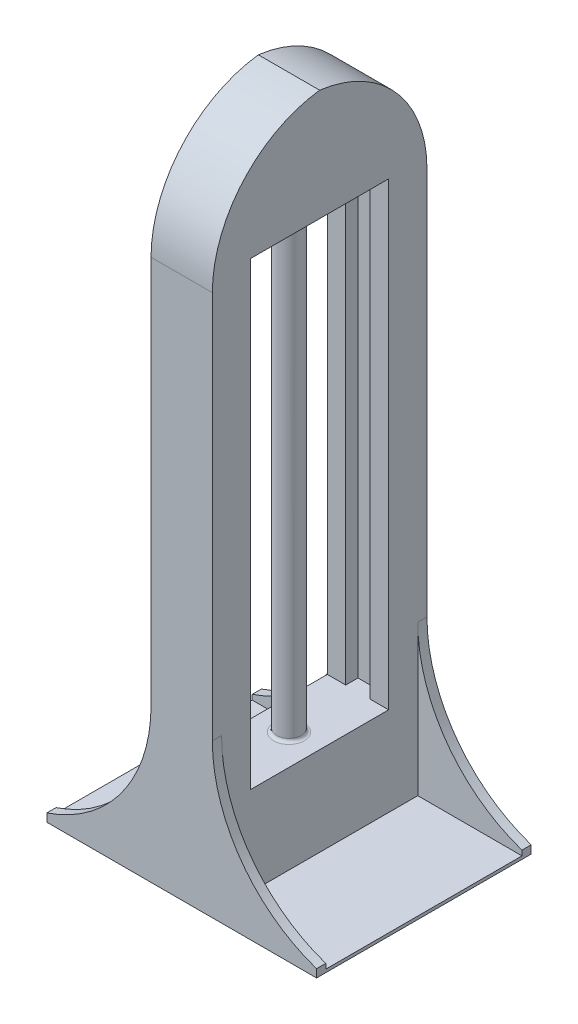
ISO-10303-21;
HEADER;
FILE_DESCRIPTION(('STEP AP214'),'2;1');
FILE_NAME('part.step','',(''),(''),'','','');
FILE_SCHEMA(('AUTOMOTIVE_DESIGN { 1 0 10303 214 1 1 1 1 }'));
ENDSEC;
DATA;
#1=APPLICATION_CONTEXT('core data for automotive mechanical design processes');
#2=APPLICATION_PROTOCOL_DEFINITION('international standard','automotive_design',2000,#1);
#3=PRODUCT_CONTEXT('',#1,'mechanical');
#4=PRODUCT('Part','Part','',(#3));
#5=PRODUCT_RELATED_PRODUCT_CATEGORY('part','',(#4));
#6=PRODUCT_DEFINITION_FORMATION('','',#4);
#7=PRODUCT_DEFINITION_CONTEXT('part definition',#1,'design');
#8=PRODUCT_DEFINITION('design','',#6,#7);
#9=PRODUCT_DEFINITION_SHAPE('','',#8);
#10=(LENGTH_UNIT() NAMED_UNIT(*) SI_UNIT(.MILLI.,.METRE.));
#11=(NAMED_UNIT(*) PLANE_ANGLE_UNIT() SI_UNIT($,.RADIAN.));
#12=(NAMED_UNIT(*) SI_UNIT($,.STERADIAN.) SOLID_ANGLE_UNIT());
#13=UNCERTAINTY_MEASURE_WITH_UNIT(LENGTH_MEASURE(1.E-05),#10,'distance_accuracy_value','');
#14=(GEOMETRIC_REPRESENTATION_CONTEXT(3) GLOBAL_UNCERTAINTY_ASSIGNED_CONTEXT((#13)) GLOBAL_UNIT_ASSIGNED_CONTEXT((#10,
#11,#12)) REPRESENTATION_CONTEXT('',''));
#15=CARTESIAN_POINT('',(0.,0.,0.));
#16=DIRECTION('',(0.,0.,1.));
#17=DIRECTION('',(1.,0.,0.));
#18=AXIS2_PLACEMENT_3D('',#15,#16,#17);
#19=CARTESIAN_POINT('',(-100.,0.,-350.));
#20=DIRECTION('',(0.,-1.,0.));
#21=DIRECTION('',(0.,0.,-1.));
#22=AXIS2_PLACEMENT_3D('',#19,#20,#21);
#23=PLANE('',#22);
#24=DIRECTION('',(1.,0.,0.));
#25=VECTOR('',#24,1.);
#26=CARTESIAN_POINT('',(-100.,0.,350.));
#27=LINE('',#26,#25);
#28=CARTESIAN_POINT('',(-440.,-2.22044604925031E-13,350.));
#29=VERTEX_POINT('',#28);
#30=CARTESIAN_POINT('',(440.,0.,350.));
#31=VERTEX_POINT('',#30);
#32=EDGE_CURVE('E244',#29,#31,#27,.T.);
#33=ORIENTED_EDGE('',*,*,#32,.F.);
#34=DIRECTION('',(0.,0.,1.));
#35=VECTOR('',#34,1.);
#36=CARTESIAN_POINT('',(-440.,0.,-350.));
#37=LINE('',#36,#35);
#38=CARTESIAN_POINT('',(-440.,-2.22044604925031E-13,-350.));
#39=VERTEX_POINT('',#38);
#40=EDGE_CURVE('E229',#39,#29,#37,.T.);
#41=ORIENTED_EDGE('',*,*,#40,.F.);
#42=DIRECTION('',(1.,0.,0.));
#43=VECTOR('',#42,1.);
#44=CARTESIAN_POINT('',(-100.,0.,-350.));
#45=LINE('',#44,#43);
#46=CARTESIAN_POINT('',(440.,-2.22044604925031E-13,-350.));
#47=VERTEX_POINT('',#46);
#48=EDGE_CURVE('E264',#39,#47,#45,.T.);
#49=ORIENTED_EDGE('',*,*,#48,.T.);
#50=DIRECTION('',(0.,0.,1.));
#51=VECTOR('',#50,1.);
#52=CARTESIAN_POINT('',(440.,0.,-350.));
#53=LINE('',#52,#51);
#54=EDGE_CURVE('E252',#47,#31,#53,.T.);
#55=ORIENTED_EDGE('',*,*,#54,.T.);
#56=EDGE_LOOP('',(#33,#41,#49,#55));
#57=FACE_BOUND('',#56,.T.);
#58=ADVANCED_FACE('F41',(#57),#23,.T.);
#59=CARTESIAN_POINT('',(0.,0.,-350.));
#60=DIRECTION('',(0.,0.,-1.));
#61=DIRECTION('',(-1.,0.,0.));
#62=AXIS2_PLACEMENT_3D('',#59,#60,#61);
#63=PLANE('',#62);
#64=ORIENTED_EDGE('',*,*,#48,.F.);
#65=DIRECTION('',(0.,1.,0.));
#66=VECTOR('',#65,1.);
#67=CARTESIAN_POINT('',(-440.,-718.05292284065,-350.));
#68=LINE('',#67,#66);
#69=CARTESIAN_POINT('',(-440.,26.2912287069192,-350.));
#70=VERTEX_POINT('',#69);
#71=EDGE_CURVE('E235',#39,#70,#68,.T.);
#72=ORIENTED_EDGE('',*,*,#71,.T.);
#73=CARTESIAN_POINT('',(-600.,500.,-350.));
#74=DIRECTION('',(0.,0.,-1.));
#75=DIRECTION('',(-1.,0.,0.));
#76=AXIS2_PLACEMENT_3D('',#73,#74,#75);
#77=CIRCLE('',#76,500.);
#78=CARTESIAN_POINT('',(-100.,500.,-350.));
#79=VERTEX_POINT('',#78);
#80=EDGE_CURVE('E306',#79,#70,#77,.T.);
#81=ORIENTED_EDGE('',*,*,#80,.F.);
#82=DIRECTION('',(0.,-1.,0.));
#83=VECTOR('',#82,1.);
#84=CARTESIAN_POINT('',(-100.,0.,-350.));
#85=LINE('',#84,#83);
#86=CARTESIAN_POINT('',(-100.,1766.,-350.));
#87=VERTEX_POINT('',#86);
#88=EDGE_CURVE('E256',#87,#79,#85,.T.);
#89=ORIENTED_EDGE('',*,*,#88,.F.);
#90=DIRECTION('',(-1.,0.,0.));
#91=VECTOR('',#90,1.);
#92=CARTESIAN_POINT('',(0.,1766.,-350.));
#93=LINE('',#92,#91);
#94=CARTESIAN_POINT('',(100.,1766.,-350.));
#95=VERTEX_POINT('',#94);
#96=EDGE_CURVE('E272',#87,#95,#93,.F.);
#97=ORIENTED_EDGE('',*,*,#96,.T.);
#98=DIRECTION('',(0.,1.,0.));
#99=VECTOR('',#98,1.);
#100=CARTESIAN_POINT('',(100.,0.,-350.));
#101=LINE('',#100,#99);
#102=CARTESIAN_POINT('',(100.,500.,-350.));
#103=VERTEX_POINT('',#102);
#104=EDGE_CURVE('E266',#103,#95,#101,.T.);
#105=ORIENTED_EDGE('',*,*,#104,.F.);
#106=CARTESIAN_POINT('',(600.,500.,-350.));
#107=DIRECTION('',(0.,0.,-1.));
#108=DIRECTION('',(-1.,0.,0.));
#109=AXIS2_PLACEMENT_3D('',#106,#107,#108);
#110=CIRCLE('',#109,500.);
#111=CARTESIAN_POINT('',(440.,26.2912287069192,-350.));
#112=VERTEX_POINT('',#111);
#113=EDGE_CURVE('E326',#103,#112,#110,.F.);
#114=ORIENTED_EDGE('',*,*,#113,.T.);
#115=DIRECTION('',(0.,1.,0.));
#116=VECTOR('',#115,1.);
#117=CARTESIAN_POINT('',(440.,-718.05292284065,-350.));
#118=LINE('',#117,#116);
#119=EDGE_CURVE('E801',#47,#112,#118,.T.);
#120=ORIENTED_EDGE('',*,*,#119,.F.);
#121=EDGE_LOOP('',(#64,#72,#81,#89,#97,#105,#114,#120));
#122=FACE_BOUND('',#121,.T.);
#123=ADVANCED_FACE('F304',(#122),#63,.T.);
#124=CARTESIAN_POINT('',(0.,0.,350.));
#125=DIRECTION('',(0.,0.,-1.));
#126=DIRECTION('',(-1.,0.,0.));
#127=AXIS2_PLACEMENT_3D('',#124,#125,#126);
#128=PLANE('',#127);
#129=DIRECTION('',(0.,1.,0.));
#130=VECTOR('',#129,1.);
#131=CARTESIAN_POINT('',(-440.,-718.05292284065,350.));
#132=LINE('',#131,#130);
#133=CARTESIAN_POINT('',(-440.,26.2912287069196,350.));
#134=VERTEX_POINT('',#133);
#135=EDGE_CURVE('E232',#29,#134,#132,.T.);
#136=ORIENTED_EDGE('',*,*,#135,.F.);
#137=ORIENTED_EDGE('',*,*,#32,.T.);
#138=DIRECTION('',(0.,1.,0.));
#139=VECTOR('',#138,1.);
#140=CARTESIAN_POINT('',(440.,-718.05292284065,350.));
#141=LINE('',#140,#139);
#142=CARTESIAN_POINT('',(440.,26.2912287069196,350.));
#143=VERTEX_POINT('',#142);
#144=EDGE_CURVE('E808',#31,#143,#141,.T.);
#145=ORIENTED_EDGE('',*,*,#144,.T.);
#146=CARTESIAN_POINT('',(600.,500.,350.));
#147=DIRECTION('',(0.,0.,-1.));
#148=DIRECTION('',(-1.,0.,0.));
#149=AXIS2_PLACEMENT_3D('',#146,#147,#148);
#150=CIRCLE('',#149,500.);
#151=CARTESIAN_POINT('',(100.,500.,350.));
#152=VERTEX_POINT('',#151);
#153=EDGE_CURVE('E323',#152,#143,#150,.F.);
#154=ORIENTED_EDGE('',*,*,#153,.F.);
#155=DIRECTION('',(0.,1.,0.));
#156=VECTOR('',#155,1.);
#157=CARTESIAN_POINT('',(100.,0.,350.));
#158=LINE('',#157,#156);
#159=CARTESIAN_POINT('',(100.,1766.,350.));
#160=VERTEX_POINT('',#159);
#161=EDGE_CURVE('E253',#152,#160,#158,.T.);
#162=ORIENTED_EDGE('',*,*,#161,.T.);
#163=DIRECTION('',(-1.,0.,0.));
#164=VECTOR('',#163,1.);
#165=CARTESIAN_POINT('',(-100.,1766.,350.));
#166=LINE('',#165,#164);
#167=CARTESIAN_POINT('',(-100.,1766.,350.));
#168=VERTEX_POINT('',#167);
#169=EDGE_CURVE('E280',#160,#168,#166,.T.);
#170=ORIENTED_EDGE('',*,*,#169,.T.);
#171=DIRECTION('',(0.,-1.,0.));
#172=VECTOR('',#171,1.);
#173=CARTESIAN_POINT('',(-100.,0.,350.));
#174=LINE('',#173,#172);
#175=CARTESIAN_POINT('',(-100.,500.,350.));
#176=VERTEX_POINT('',#175);
#177=EDGE_CURVE('E254',#168,#176,#174,.T.);
#178=ORIENTED_EDGE('',*,*,#177,.T.);
#179=CARTESIAN_POINT('',(-600.,500.,350.));
#180=DIRECTION('',(0.,0.,-1.));
#181=DIRECTION('',(-1.,0.,0.));
#182=AXIS2_PLACEMENT_3D('',#179,#180,#181);
#183=CIRCLE('',#182,500.);
#184=EDGE_CURVE('E248',#176,#134,#183,.T.);
#185=ORIENTED_EDGE('',*,*,#184,.T.);
#186=EDGE_LOOP('',(#136,#137,#145,#154,#162,#170,#178,#185));
#187=FACE_BOUND('',#186,.T.);
#188=ADVANCED_FACE('F242',(#187),#128,.F.);
#189=CARTESIAN_POINT('',(-600.,0.,-320.));
#190=DIRECTION('',(0.,0.,1.));
#191=DIRECTION('',(1.,0.,0.));
#192=AXIS2_PLACEMENT_3D('',#189,#190,#191);
#193=PLANE('',#192);
#194=CARTESIAN_POINT('',(-600.,500.,-320.));
#195=DIRECTION('',(0.,0.,1.));
#196=DIRECTION('',(1.,0.,0.));
#197=AXIS2_PLACEMENT_3D('',#194,#195,#196);
#198=CIRCLE('',#197,500.);
#199=CARTESIAN_POINT('',(-440.000000000001,26.2912287069194,-320.));
#200=VERTEX_POINT('',#199);
#201=CARTESIAN_POINT('',(-100.,500.,-320.));
#202=VERTEX_POINT('',#201);
#203=EDGE_CURVE('E317',#200,#202,#198,.T.);
#204=ORIENTED_EDGE('',*,*,#203,.F.);
#205=DIRECTION('',(0.,-1.,0.));
#206=VECTOR('',#205,1.);
#207=CARTESIAN_POINT('',(-440.,0.,-320.));
#208=LINE('',#207,#206);
#209=CARTESIAN_POINT('',(-440.,10.,-320.));
#210=VERTEX_POINT('',#209);
#211=EDGE_CURVE('E56',#200,#210,#208,.T.);
#212=ORIENTED_EDGE('',*,*,#211,.T.);
#213=DIRECTION('',(-1.,0.,0.));
#214=VECTOR('',#213,1.);
#215=CARTESIAN_POINT('',(-600.,10.,-320.));
#216=LINE('',#215,#214);
#217=CARTESIAN_POINT('',(-100.,10.,-320.));
#218=VERTEX_POINT('',#217);
#219=EDGE_CURVE('E333',#218,#210,#216,.T.);
#220=ORIENTED_EDGE('',*,*,#219,.F.);
#221=DIRECTION('',(0.,-1.,0.));
#222=VECTOR('',#221,1.);
#223=CARTESIAN_POINT('',(-100.,0.,-320.));
#224=LINE('',#223,#222);
#225=EDGE_CURVE('E344',#202,#218,#224,.T.);
#226=ORIENTED_EDGE('',*,*,#225,.F.);
#227=EDGE_LOOP('',(#204,#212,#220,#226));
#228=FACE_BOUND('',#227,.T.);
#229=ADVANCED_FACE('F563',(#228),#193,.T.);
#230=CARTESIAN_POINT('',(-600.,0.,320.));
#231=DIRECTION('',(0.,0.,-1.));
#232=DIRECTION('',(-1.,0.,0.));
#233=AXIS2_PLACEMENT_3D('',#230,#231,#232);
#234=PLANE('',#233);
#235=DIRECTION('',(1.,0.,0.));
#236=VECTOR('',#235,1.);
#237=CARTESIAN_POINT('',(-600.,10.,320.));
#238=LINE('',#237,#236);
#239=CARTESIAN_POINT('',(-440.,10.,320.));
#240=VERTEX_POINT('',#239);
#241=CARTESIAN_POINT('',(-100.,10.,320.));
#242=VERTEX_POINT('',#241);
#243=EDGE_CURVE('E329',#240,#242,#238,.T.);
#244=ORIENTED_EDGE('',*,*,#243,.F.);
#245=DIRECTION('',(0.,1.,0.));
#246=VECTOR('',#245,1.);
#247=CARTESIAN_POINT('',(-440.,0.,320.));
#248=LINE('',#247,#246);
#249=CARTESIAN_POINT('',(-440.,26.2912287069196,320.));
#250=VERTEX_POINT('',#249);
#251=EDGE_CURVE('E800',#240,#250,#248,.T.);
#252=ORIENTED_EDGE('',*,*,#251,.T.);
#253=CARTESIAN_POINT('',(-600.,500.,320.));
#254=DIRECTION('',(0.,0.,-1.));
#255=DIRECTION('',(-1.,0.,0.));
#256=AXIS2_PLACEMENT_3D('',#253,#254,#255);
#257=CIRCLE('',#256,500.);
#258=CARTESIAN_POINT('',(-100.,500.,320.));
#259=VERTEX_POINT('',#258);
#260=EDGE_CURVE('E798',#259,#250,#257,.T.);
#261=ORIENTED_EDGE('',*,*,#260,.F.);
#262=DIRECTION('',(0.,1.,0.));
#263=VECTOR('',#262,1.);
#264=CARTESIAN_POINT('',(-100.,0.,320.));
#265=LINE('',#264,#263);
#266=EDGE_CURVE('E347',#242,#259,#265,.T.);
#267=ORIENTED_EDGE('',*,*,#266,.F.);
#268=EDGE_LOOP('',(#244,#252,#261,#267));
#269=FACE_BOUND('',#268,.T.);
#270=ADVANCED_FACE('F567',(#269),#234,.T.);
#271=CARTESIAN_POINT('',(0.,10.,0.));
#272=DIRECTION('',(0.,1.,0.));
#273=DIRECTION('',(0.,0.,1.));
#274=AXIS2_PLACEMENT_3D('',#271,#272,#273);
#275=PLANE('',#274);
#276=ORIENTED_EDGE('',*,*,#219,.T.);
#277=DIRECTION('',(0.,0.,1.));
#278=VECTOR('',#277,1.);
#279=CARTESIAN_POINT('',(-440.,10.,0.));
#280=LINE('',#279,#278);
#281=EDGE_CURVE('E778',#210,#240,#280,.T.);
#282=ORIENTED_EDGE('',*,*,#281,.T.);
#283=ORIENTED_EDGE('',*,*,#243,.T.);
#284=DIRECTION('',(0.,0.,-1.));
#285=VECTOR('',#284,1.);
#286=CARTESIAN_POINT('',(-100.,10.,-350.));
#287=LINE('',#286,#285);
#288=EDGE_CURVE('E331',#242,#218,#287,.T.);
#289=ORIENTED_EDGE('',*,*,#288,.T.);
#290=EDGE_LOOP('',(#276,#282,#283,#289));
#291=FACE_BOUND('',#290,.T.);
#292=ADVANCED_FACE('F573',(#291),#275,.T.);
#293=CARTESIAN_POINT('',(-600.,500.,3600.74773511017));
#294=DIRECTION('',(0.,0.,-1.));
#295=DIRECTION('',(-1.,0.,0.));
#296=AXIS2_PLACEMENT_3D('',#293,#294,#295);
#297=CYLINDRICAL_SURFACE('',#296,500.);
#298=DIRECTION('',(0.,0.,-1.));
#299=VECTOR('',#298,1.);
#300=CARTESIAN_POINT('',(-440.000000000001,26.2912287069195,3600.74773511017));
#301=LINE('',#300,#299);
#302=EDGE_CURVE('E11',#134,#250,#301,.T.);
#303=ORIENTED_EDGE('',*,*,#302,.F.);
#304=ORIENTED_EDGE('',*,*,#184,.F.);
#305=DIRECTION('',(0.,0.,1.));
#306=VECTOR('',#305,1.);
#307=CARTESIAN_POINT('',(-100.,500.,350.));
#308=LINE('',#307,#306);
#309=EDGE_CURVE('E345',#259,#176,#308,.T.);
#310=ORIENTED_EDGE('',*,*,#309,.F.);
#311=ORIENTED_EDGE('',*,*,#260,.T.);
#312=EDGE_LOOP('',(#303,#304,#310,#311));
#313=FACE_BOUND('',#312,.T.);
#314=ADVANCED_FACE('F698',(#313),#297,.F.);
#315=EDGE_CURVE('E45',#200,#70,#301,.T.);
#316=ORIENTED_EDGE('',*,*,#315,.F.);
#317=ORIENTED_EDGE('',*,*,#203,.T.);
#318=DIRECTION('',(0.,0.,1.));
#319=VECTOR('',#318,1.);
#320=CARTESIAN_POINT('',(-100.,500.,-350.));
#321=LINE('',#320,#319);
#322=EDGE_CURVE('E312',#79,#202,#321,.T.);
#323=ORIENTED_EDGE('',*,*,#322,.F.);
#324=ORIENTED_EDGE('',*,*,#80,.T.);
#325=EDGE_LOOP('',(#316,#317,#323,#324));
#326=FACE_BOUND('',#325,.T.);
#327=ADVANCED_FACE('F310',(#326),#297,.F.);
#328=CARTESIAN_POINT('',(600.,500.,3600.74773511017));
#329=DIRECTION('',(0.,0.,-1.));
#330=DIRECTION('',(-1.,0.,0.));
#331=AXIS2_PLACEMENT_3D('',#328,#329,#330);
#332=CYLINDRICAL_SURFACE('',#331,500.);
#333=DIRECTION('',(0.,0.,-1.));
#334=VECTOR('',#333,1.);
#335=CARTESIAN_POINT('',(440.000000000001,26.2912287069195,3600.74773511017));
#336=LINE('',#335,#334);
#337=CARTESIAN_POINT('',(440.,26.2912287069196,-320.));
#338=VERTEX_POINT('',#337);
#339=EDGE_CURVE('E297',#112,#338,#336,.F.);
#340=ORIENTED_EDGE('',*,*,#339,.F.);
#341=ORIENTED_EDGE('',*,*,#113,.F.);
#342=DIRECTION('',(0.,0.,1.));
#343=VECTOR('',#342,1.);
#344=CARTESIAN_POINT('',(100.,500.,-350.));
#345=LINE('',#344,#343);
#346=CARTESIAN_POINT('',(100.,500.,-320.));
#347=VERTEX_POINT('',#346);
#348=EDGE_CURVE('E358',#103,#347,#345,.T.);
#349=ORIENTED_EDGE('',*,*,#348,.T.);
#350=CARTESIAN_POINT('',(600.,500.,-320.));
#351=DIRECTION('',(0.,0.,-1.));
#352=DIRECTION('',(-1.,0.,0.));
#353=AXIS2_PLACEMENT_3D('',#350,#351,#352);
#354=CIRCLE('',#353,500.);
#355=EDGE_CURVE('E315',#347,#338,#354,.F.);
#356=ORIENTED_EDGE('',*,*,#355,.T.);
#357=EDGE_LOOP('',(#340,#341,#349,#356));
#358=FACE_BOUND('',#357,.T.);
#359=ADVANCED_FACE('F667',(#358),#332,.F.);
#360=DIRECTION('',(0.,0.,1.));
#361=VECTOR('',#360,1.);
#362=CARTESIAN_POINT('',(440.,10.,0.));
#363=LINE('',#362,#361);
#364=CARTESIAN_POINT('',(440.,10.,-320.));
#365=VERTEX_POINT('',#364);
#366=CARTESIAN_POINT('',(440.,10.,320.));
#367=VERTEX_POINT('',#366);
#368=EDGE_CURVE('E811',#365,#367,#363,.T.);
#369=ORIENTED_EDGE('',*,*,#368,.F.);
#370=DIRECTION('',(1.,0.,0.));
#371=VECTOR('',#370,1.);
#372=CARTESIAN_POINT('',(600.,10.,-320.));
#373=LINE('',#372,#371);
#374=CARTESIAN_POINT('',(100.,10.,-320.));
#375=VERTEX_POINT('',#374);
#376=EDGE_CURVE('E341',#375,#365,#373,.T.);
#377=ORIENTED_EDGE('',*,*,#376,.F.);
#378=DIRECTION('',(0.,0.,1.));
#379=VECTOR('',#378,1.);
#380=CARTESIAN_POINT('',(100.,10.,-350.));
#381=LINE('',#380,#379);
#382=CARTESIAN_POINT('',(100.,10.,320.));
#383=VERTEX_POINT('',#382);
#384=EDGE_CURVE('E338',#375,#383,#381,.T.);
#385=ORIENTED_EDGE('',*,*,#384,.T.);
#386=DIRECTION('',(-1.,0.,0.));
#387=VECTOR('',#386,1.);
#388=CARTESIAN_POINT('',(600.,10.,320.));
#389=LINE('',#388,#387);
#390=EDGE_CURVE('E336',#367,#383,#389,.T.);
#391=ORIENTED_EDGE('',*,*,#390,.F.);
#392=EDGE_LOOP('',(#369,#377,#385,#391));
#393=FACE_BOUND('',#392,.T.);
#394=ADVANCED_FACE('F528',(#393),#275,.T.);
#395=CARTESIAN_POINT('',(-100.,0.,-350.));
#396=DIRECTION('',(-1.,0.,0.));
#397=DIRECTION('',(0.,0.,1.));
#398=AXIS2_PLACEMENT_3D('',#395,#396,#397);
#399=PLANE('',#398);
#400=DIRECTION('',(0.,-1.,0.));
#401=VECTOR('',#400,1.);
#402=CARTESIAN_POINT('',(-100.,300.,225.));
#403=LINE('',#402,#401);
#404=CARTESIAN_POINT('',(-100.,1800.,225.));
#405=VERTEX_POINT('',#404);
#406=CARTESIAN_POINT('',(-100.,300.,225.));
#407=VERTEX_POINT('',#406);
#408=EDGE_CURVE('E436',#405,#407,#403,.T.);
#409=ORIENTED_EDGE('',*,*,#408,.T.);
#410=DIRECTION('',(0.,0.,-1.));
#411=VECTOR('',#410,1.);
#412=CARTESIAN_POINT('',(-100.,300.,225.));
#413=LINE('',#412,#411);
#414=CARTESIAN_POINT('',(-100.,300.,-225.));
#415=VERTEX_POINT('',#414);
#416=EDGE_CURVE('E431',#407,#415,#413,.T.);
#417=ORIENTED_EDGE('',*,*,#416,.T.);
#418=DIRECTION('',(0.,1.,0.));
#419=VECTOR('',#418,1.);
#420=CARTESIAN_POINT('',(-100.,300.,-225.));
#421=LINE('',#420,#419);
#422=CARTESIAN_POINT('',(-100.,1800.,-225.));
#423=VERTEX_POINT('',#422);
#424=EDGE_CURVE('E427',#415,#423,#421,.T.);
#425=ORIENTED_EDGE('',*,*,#424,.T.);
#426=DIRECTION('',(0.,0.,1.));
#427=VECTOR('',#426,1.);
#428=CARTESIAN_POINT('',(-100.,1800.,225.));
#429=LINE('',#428,#427);
#430=EDGE_CURVE('E417',#423,#405,#429,.T.);
#431=ORIENTED_EDGE('',*,*,#430,.T.);
#432=EDGE_LOOP('',(#409,#417,#425,#431));
#433=FACE_BOUND('',#432,.T.);
#434=ORIENTED_EDGE('',*,*,#266,.T.);
#435=ORIENTED_EDGE('',*,*,#309,.T.);
#436=ORIENTED_EDGE('',*,*,#177,.F.);
#437=CARTESIAN_POINT('',(-100.,1766.,-50.0000000000002));
#438=DIRECTION('',(-1.,0.,0.));
#439=DIRECTION('',(0.,0.,1.));
#440=AXIS2_PLACEMENT_3D('',#437,#438,#439);
#441=CIRCLE('',#440,400.);
#442=CARTESIAN_POINT('',(-100.,2162.86269665969,0.));
#443=VERTEX_POINT('',#442);
#444=EDGE_CURVE('E268',#168,#443,#441,.T.);
#445=ORIENTED_EDGE('',*,*,#444,.T.);
#446=CARTESIAN_POINT('',(-100.,1766.,50.0000000000002));
#447=DIRECTION('',(-1.,0.,0.));
#448=DIRECTION('',(0.,0.,1.));
#449=AXIS2_PLACEMENT_3D('',#446,#447,#448);
#450=CIRCLE('',#449,400.);
#451=EDGE_CURVE('E270',#443,#87,#450,.T.);
#452=ORIENTED_EDGE('',*,*,#451,.T.);
#453=ORIENTED_EDGE('',*,*,#88,.T.);
#454=ORIENTED_EDGE('',*,*,#322,.T.);
#455=ORIENTED_EDGE('',*,*,#225,.T.);
#456=ORIENTED_EDGE('',*,*,#288,.F.);
#457=EDGE_LOOP('',(#434,#435,#436,#445,#452,#453,#454,#455,#456));
#458=FACE_BOUND('',#457,.T.);
#459=ADVANCED_FACE('F489',(#433,#458),#399,.T.);
#460=CARTESIAN_POINT('',(-1666.04597633658,300.,225.));
#461=DIRECTION('',(0.,0.,1.));
#462=DIRECTION('',(1.,0.,0.));
#463=AXIS2_PLACEMENT_3D('',#460,#461,#462);
#464=PLANE('',#463);
#465=DIRECTION('',(0.,-1.,0.));
#466=VECTOR('',#465,1.);
#467=CARTESIAN_POINT('',(-40.,1800.,225.));
#468=LINE('',#467,#466);
#469=CARTESIAN_POINT('',(-40.,1800.,225.));
#470=VERTEX_POINT('',#469);
#471=CARTESIAN_POINT('',(-39.9999999999998,300.,225.));
#472=VERTEX_POINT('',#471);
#473=EDGE_CURVE('E360',#470,#472,#468,.T.);
#474=ORIENTED_EDGE('',*,*,#473,.T.);
#475=DIRECTION('',(1.,0.,0.));
#476=VECTOR('',#475,1.);
#477=CARTESIAN_POINT('',(-1666.04597633658,300.,225.));
#478=LINE('',#477,#476);
#479=EDGE_CURVE('E435',#407,#472,#478,.T.);
#480=ORIENTED_EDGE('',*,*,#479,.F.);
#481=ORIENTED_EDGE('',*,*,#408,.F.);
#482=DIRECTION('',(1.,0.,0.));
#483=VECTOR('',#482,1.);
#484=CARTESIAN_POINT('',(-1666.04597633658,1800.,225.));
#485=LINE('',#484,#483);
#486=EDGE_CURVE('E439',#405,#470,#485,.T.);
#487=ORIENTED_EDGE('',*,*,#486,.T.);
#488=EDGE_LOOP('',(#474,#480,#481,#487));
#489=FACE_BOUND('',#488,.T.);
#490=ADVANCED_FACE('F487',(#489),#464,.F.);
#491=DIRECTION('',(0.,1.,0.));
#492=VECTOR('',#491,1.);
#493=CARTESIAN_POINT('',(40.,1800.,225.));
#494=LINE('',#493,#492);
#495=CARTESIAN_POINT('',(40.0000000000007,300.,225.));
#496=VERTEX_POINT('',#495);
#497=CARTESIAN_POINT('',(40.,1800.,225.));
#498=VERTEX_POINT('',#497);
#499=EDGE_CURVE('E368',#496,#498,#494,.T.);
#500=ORIENTED_EDGE('',*,*,#499,.T.);
#501=CARTESIAN_POINT('',(100.,1800.,225.));
#502=VERTEX_POINT('',#501);
#503=EDGE_CURVE('E426',#498,#502,#485,.T.);
#504=ORIENTED_EDGE('',*,*,#503,.T.);
#505=DIRECTION('',(0.,-1.,0.));
#506=VECTOR('',#505,1.);
#507=CARTESIAN_POINT('',(100.,300.,225.));
#508=LINE('',#507,#506);
#509=CARTESIAN_POINT('',(100.,300.,225.));
#510=VERTEX_POINT('',#509);
#511=EDGE_CURVE('E418',#502,#510,#508,.T.);
#512=ORIENTED_EDGE('',*,*,#511,.T.);
#513=EDGE_CURVE('E438',#496,#510,#478,.T.);
#514=ORIENTED_EDGE('',*,*,#513,.F.);
#515=EDGE_LOOP('',(#500,#504,#512,#514));
#516=FACE_BOUND('',#515,.T.);
#517=ADVANCED_FACE('F466',(#516),#464,.F.);
#518=CARTESIAN_POINT('',(-1666.04597633658,300.,-225.));
#519=DIRECTION('',(0.,0.,-1.));
#520=DIRECTION('',(0.,1.,0.));
#521=AXIS2_PLACEMENT_3D('',#518,#519,#520);
#522=PLANE('',#521);
#523=DIRECTION('',(1.,0.,0.));
#524=VECTOR('',#523,1.);
#525=CARTESIAN_POINT('',(-1666.04597633658,300.,-225.));
#526=LINE('',#525,#524);
#527=CARTESIAN_POINT('',(-39.9999999999998,300.,-225.));
#528=VERTEX_POINT('',#527);
#529=EDGE_CURVE('E430',#415,#528,#526,.T.);
#530=ORIENTED_EDGE('',*,*,#529,.T.);
#531=DIRECTION('',(0.,-1.,0.));
#532=VECTOR('',#531,1.);
#533=CARTESIAN_POINT('',(-40.,1800.,-225.));
#534=LINE('',#533,#532);
#535=CARTESIAN_POINT('',(-40.,1800.,-225.));
#536=VERTEX_POINT('',#535);
#537=EDGE_CURVE('E381',#536,#528,#534,.T.);
#538=ORIENTED_EDGE('',*,*,#537,.F.);
#539=DIRECTION('',(1.,0.,0.));
#540=VECTOR('',#539,1.);
#541=CARTESIAN_POINT('',(-1666.04597633658,1800.,-225.));
#542=LINE('',#541,#540);
#543=EDGE_CURVE('E285',#423,#536,#542,.T.);
#544=ORIENTED_EDGE('',*,*,#543,.F.);
#545=ORIENTED_EDGE('',*,*,#424,.F.);
#546=EDGE_LOOP('',(#530,#538,#544,#545));
#547=FACE_BOUND('',#546,.T.);
#548=ADVANCED_FACE('F495',(#547),#522,.F.);
#549=CARTESIAN_POINT('',(100.,0.,-350.));
#550=DIRECTION('',(1.,0.,0.));
#551=DIRECTION('',(0.,0.,-1.));
#552=AXIS2_PLACEMENT_3D('',#549,#550,#551);
#553=PLANE('',#552);
#554=DIRECTION('',(0.,0.,-1.));
#555=VECTOR('',#554,1.);
#556=CARTESIAN_POINT('',(100.,300.,225.));
#557=LINE('',#556,#555);
#558=CARTESIAN_POINT('',(100.,300.,-225.));
#559=VERTEX_POINT('',#558);
#560=EDGE_CURVE('E414',#510,#559,#557,.T.);
#561=ORIENTED_EDGE('',*,*,#560,.F.);
#562=ORIENTED_EDGE('',*,*,#511,.F.);
#563=DIRECTION('',(0.,0.,1.));
#564=VECTOR('',#563,1.);
#565=CARTESIAN_POINT('',(100.,1800.,225.));
#566=LINE('',#565,#564);
#567=CARTESIAN_POINT('',(100.,1800.,-225.));
#568=VERTEX_POINT('',#567);
#569=EDGE_CURVE('E420',#568,#502,#566,.T.);
#570=ORIENTED_EDGE('',*,*,#569,.F.);
#571=DIRECTION('',(0.,1.,0.));
#572=VECTOR('',#571,1.);
#573=CARTESIAN_POINT('',(100.,300.,-225.));
#574=LINE('',#573,#572);
#575=EDGE_CURVE('E407',#559,#568,#574,.T.);
#576=ORIENTED_EDGE('',*,*,#575,.F.);
#577=EDGE_LOOP('',(#561,#562,#570,#576));
#578=FACE_BOUND('',#577,.T.);
#579=DIRECTION('',(0.,0.,1.));
#580=VECTOR('',#579,1.);
#581=CARTESIAN_POINT('',(100.,500.,350.));
#582=LINE('',#581,#580);
#583=CARTESIAN_POINT('',(100.,500.,320.));
#584=VERTEX_POINT('',#583);
#585=EDGE_CURVE('E357',#584,#152,#582,.T.);
#586=ORIENTED_EDGE('',*,*,#585,.F.);
#587=DIRECTION('',(0.,1.,0.));
#588=VECTOR('',#587,1.);
#589=CARTESIAN_POINT('',(100.,0.,320.));
#590=LINE('',#589,#588);
#591=EDGE_CURVE('E354',#383,#584,#590,.T.);
#592=ORIENTED_EDGE('',*,*,#591,.F.);
#593=ORIENTED_EDGE('',*,*,#384,.F.);
#594=DIRECTION('',(0.,-1.,0.));
#595=VECTOR('',#594,1.);
#596=CARTESIAN_POINT('',(100.,0.,-320.));
#597=LINE('',#596,#595);
#598=EDGE_CURVE('E350',#347,#375,#597,.T.);
#599=ORIENTED_EDGE('',*,*,#598,.F.);
#600=ORIENTED_EDGE('',*,*,#348,.F.);
#601=ORIENTED_EDGE('',*,*,#104,.T.);
#602=CARTESIAN_POINT('',(100.,1766.,50.0000000000002));
#603=DIRECTION('',(1.,0.,0.));
#604=DIRECTION('',(0.,0.,-1.));
#605=AXIS2_PLACEMENT_3D('',#602,#603,#604);
#606=CIRCLE('',#605,400.);
#607=CARTESIAN_POINT('',(100.,2162.86269665969,0.));
#608=VERTEX_POINT('',#607);
#609=EDGE_CURVE('E278',#95,#608,#606,.T.);
#610=ORIENTED_EDGE('',*,*,#609,.T.);
#611=CARTESIAN_POINT('',(100.,1766.,-50.0000000000002));
#612=DIRECTION('',(1.,0.,0.));
#613=DIRECTION('',(0.,0.,-1.));
#614=AXIS2_PLACEMENT_3D('',#611,#612,#613);
#615=CIRCLE('',#614,400.);
#616=EDGE_CURVE('E275',#608,#160,#615,.T.);
#617=ORIENTED_EDGE('',*,*,#616,.T.);
#618=ORIENTED_EDGE('',*,*,#161,.F.);
#619=EDGE_LOOP('',(#586,#592,#593,#599,#600,#601,#610,#617,#618));
#620=FACE_BOUND('',#619,.T.);
#621=ADVANCED_FACE('F461',(#578,#620),#553,.T.);
#622=CARTESIAN_POINT('',(0.,1766.,-50.0000000000002));
#623=DIRECTION('',(1.,0.,0.));
#624=DIRECTION('',(0.,0.,-1.));
#625=AXIS2_PLACEMENT_3D('',#622,#623,#624);
#626=CYLINDRICAL_SURFACE('',#625,400.);
#627=ORIENTED_EDGE('',*,*,#169,.F.);
#628=ORIENTED_EDGE('',*,*,#616,.F.);
#629=DIRECTION('',(1.,0.,0.));
#630=VECTOR('',#629,1.);
#631=CARTESIAN_POINT('',(0.,2162.86269665969,0.));
#632=LINE('',#631,#630);
#633=EDGE_CURVE('E258',#443,#608,#632,.T.);
#634=ORIENTED_EDGE('',*,*,#633,.F.);
#635=ORIENTED_EDGE('',*,*,#444,.F.);
#636=EDGE_LOOP('',(#627,#628,#634,#635));
#637=FACE_BOUND('',#636,.T.);
#638=ADVANCED_FACE('F532',(#637),#626,.T.);
#639=CARTESIAN_POINT('',(-100.,1766.,50.0000000000002));
#640=DIRECTION('',(-1.,0.,0.));
#641=DIRECTION('',(0.,0.,1.));
#642=AXIS2_PLACEMENT_3D('',#639,#640,#641);
#643=CYLINDRICAL_SURFACE('',#642,400.);
#644=ORIENTED_EDGE('',*,*,#609,.F.);
#645=ORIENTED_EDGE('',*,*,#96,.F.);
#646=ORIENTED_EDGE('',*,*,#451,.F.);
#647=ORIENTED_EDGE('',*,*,#633,.T.);
#648=EDGE_LOOP('',(#644,#645,#646,#647));
#649=FACE_BOUND('',#648,.T.);
#650=ADVANCED_FACE('F529',(#649),#643,.T.);
#651=CARTESIAN_POINT('',(-1666.04597633658,1800.,225.));
#652=DIRECTION('',(0.,1.,0.));
#653=DIRECTION('',(0.,0.,1.));
#654=AXIS2_PLACEMENT_3D('',#651,#652,#653);
#655=PLANE('',#654);
#656=CARTESIAN_POINT('',(0.,1800.,0.));
#657=DIRECTION('',(0.,1.,0.));
#658=DIRECTION('',(0.,0.,1.));
#659=AXIS2_PLACEMENT_3D('',#656,#657,#658);
#660=CIRCLE('',#659,50.);
#661=CARTESIAN_POINT('',(0.,1800.,50.));
#662=VERTEX_POINT('',#661);
#663=EDGE_CURVE('E291',#662,#662,#660,.T.);
#664=ORIENTED_EDGE('',*,*,#663,.T.);
#665=EDGE_LOOP('',(#664));
#666=FACE_BOUND('',#665,.T.);
#667=ORIENTED_EDGE('',*,*,#543,.T.);
#668=DIRECTION('',(0.,0.,1.));
#669=VECTOR('',#668,1.);
#670=CARTESIAN_POINT('',(-40.,1800.,-265.));
#671=LINE('',#670,#669);
#672=CARTESIAN_POINT('',(-40.,1800.,-265.));
#673=VERTEX_POINT('',#672);
#674=EDGE_CURVE('E405',#673,#536,#671,.T.);
#675=ORIENTED_EDGE('',*,*,#674,.F.);
#676=DIRECTION('',(-1.,0.,0.));
#677=VECTOR('',#676,1.);
#678=CARTESIAN_POINT('',(-40.,1800.,-265.));
#679=LINE('',#678,#677);
#680=CARTESIAN_POINT('',(40.,1800.,-265.));
#681=VERTEX_POINT('',#680);
#682=EDGE_CURVE('E398',#681,#673,#679,.T.);
#683=ORIENTED_EDGE('',*,*,#682,.F.);
#684=DIRECTION('',(0.,0.,1.));
#685=VECTOR('',#684,1.);
#686=CARTESIAN_POINT('',(40.,1800.,-265.));
#687=LINE('',#686,#685);
#688=CARTESIAN_POINT('',(40.,1800.,-225.));
#689=VERTEX_POINT('',#688);
#690=EDGE_CURVE('E408',#681,#689,#687,.T.);
#691=ORIENTED_EDGE('',*,*,#690,.T.);
#692=EDGE_CURVE('E429',#689,#568,#542,.T.);
#693=ORIENTED_EDGE('',*,*,#692,.T.);
#694=ORIENTED_EDGE('',*,*,#569,.T.);
#695=ORIENTED_EDGE('',*,*,#503,.F.);
#696=DIRECTION('',(0.,0.,-1.));
#697=VECTOR('',#696,1.);
#698=CARTESIAN_POINT('',(40.,1800.,265.));
#699=LINE('',#698,#697);
#700=CARTESIAN_POINT('',(40.,1800.,265.));
#701=VERTEX_POINT('',#700);
#702=EDGE_CURVE('E385',#701,#498,#699,.T.);
#703=ORIENTED_EDGE('',*,*,#702,.F.);
#704=DIRECTION('',(-1.,0.,0.));
#705=VECTOR('',#704,1.);
#706=CARTESIAN_POINT('',(-40.,1800.,265.));
#707=LINE('',#706,#705);
#708=CARTESIAN_POINT('',(-40.,1800.,265.));
#709=VERTEX_POINT('',#708);
#710=EDGE_CURVE('E367',#701,#709,#707,.T.);
#711=ORIENTED_EDGE('',*,*,#710,.T.);
#712=DIRECTION('',(0.,0.,-1.));
#713=VECTOR('',#712,1.);
#714=CARTESIAN_POINT('',(-40.,1800.,265.));
#715=LINE('',#714,#713);
#716=EDGE_CURVE('E374',#709,#470,#715,.T.);
#717=ORIENTED_EDGE('',*,*,#716,.T.);
#718=ORIENTED_EDGE('',*,*,#486,.F.);
#719=ORIENTED_EDGE('',*,*,#430,.F.);
#720=EDGE_LOOP('',(#667,#675,#683,#691,#693,#694,#695,#703,#711,#717,#718,#719));
#721=FACE_BOUND('',#720,.T.);
#722=ADVANCED_FACE('F452',(#666,#721),#655,.F.);
#723=CARTESIAN_POINT('',(-1666.04597633658,300.,225.));
#724=DIRECTION('',(0.,-1.,0.));
#725=DIRECTION('',(0.,0.,-1.));
#726=AXIS2_PLACEMENT_3D('',#723,#724,#725);
#727=PLANE('',#726);
#728=CARTESIAN_POINT('',(0.,300.,0.));
#729=DIRECTION('',(0.,-1.,0.));
#730=DIRECTION('',(0.,0.,-1.));
#731=AXIS2_PLACEMENT_3D('',#728,#729,#730);
#732=CIRCLE('',#731,50.);
#733=CARTESIAN_POINT('',(0.,300.,-50.));
#734=VERTEX_POINT('',#733);
#735=EDGE_CURVE('E294',#734,#734,#732,.T.);
#736=ORIENTED_EDGE('',*,*,#735,.T.);
#737=EDGE_LOOP('',(#736));
#738=FACE_BOUND('',#737,.T.);
#739=ORIENTED_EDGE('',*,*,#479,.T.);
#740=DIRECTION('',(0.,0.,-1.));
#741=VECTOR('',#740,1.);
#742=CARTESIAN_POINT('',(-39.9999999999998,300.,265.));
#743=LINE('',#742,#741);
#744=CARTESIAN_POINT('',(-39.9999999999998,300.,265.));
#745=VERTEX_POINT('',#744);
#746=EDGE_CURVE('E379',#745,#472,#743,.T.);
#747=ORIENTED_EDGE('',*,*,#746,.F.);
#748=DIRECTION('',(1.,0.,0.));
#749=VECTOR('',#748,1.);
#750=CARTESIAN_POINT('',(-39.9999999999998,300.,265.));
#751=LINE('',#750,#749);
#752=CARTESIAN_POINT('',(40.0000000000005,300.,265.));
#753=VERTEX_POINT('',#752);
#754=EDGE_CURVE('E372',#745,#753,#751,.T.);
#755=ORIENTED_EDGE('',*,*,#754,.T.);
#756=DIRECTION('',(0.,0.,-1.));
#757=VECTOR('',#756,1.);
#758=CARTESIAN_POINT('',(40.0000000000005,300.,265.));
#759=LINE('',#758,#757);
#760=EDGE_CURVE('E382',#753,#496,#759,.T.);
#761=ORIENTED_EDGE('',*,*,#760,.T.);
#762=ORIENTED_EDGE('',*,*,#513,.T.);
#763=ORIENTED_EDGE('',*,*,#560,.T.);
#764=CARTESIAN_POINT('',(40.0000000000005,300.,-225.));
#765=VERTEX_POINT('',#764);
#766=EDGE_CURVE('E434',#765,#559,#526,.T.);
#767=ORIENTED_EDGE('',*,*,#766,.F.);
#768=DIRECTION('',(0.,0.,1.));
#769=VECTOR('',#768,1.);
#770=CARTESIAN_POINT('',(40.0000000000005,300.,-265.));
#771=LINE('',#770,#769);
#772=CARTESIAN_POINT('',(40.0000000000005,300.,-265.));
#773=VERTEX_POINT('',#772);
#774=EDGE_CURVE('E410',#773,#765,#771,.T.);
#775=ORIENTED_EDGE('',*,*,#774,.F.);
#776=DIRECTION('',(1.,0.,0.));
#777=VECTOR('',#776,1.);
#778=CARTESIAN_POINT('',(-39.9999999999998,300.,-265.));
#779=LINE('',#778,#777);
#780=CARTESIAN_POINT('',(-39.9999999999998,300.,-265.));
#781=VERTEX_POINT('',#780);
#782=EDGE_CURVE('E391',#781,#773,#779,.T.);
#783=ORIENTED_EDGE('',*,*,#782,.F.);
#784=DIRECTION('',(0.,0.,1.));
#785=VECTOR('',#784,1.);
#786=CARTESIAN_POINT('',(-39.9999999999998,300.,-265.));
#787=LINE('',#786,#785);
#788=EDGE_CURVE('E401',#781,#528,#787,.T.);
#789=ORIENTED_EDGE('',*,*,#788,.T.);
#790=ORIENTED_EDGE('',*,*,#529,.F.);
#791=ORIENTED_EDGE('',*,*,#416,.F.);
#792=EDGE_LOOP('',(#739,#747,#755,#761,#762,#763,#767,#775,#783,#789,#790,#791));
#793=FACE_BOUND('',#792,.T.);
#794=ADVANCED_FACE('F468',(#738,#793),#727,.F.);
#795=ORIENTED_EDGE('',*,*,#692,.F.);
#796=DIRECTION('',(0.,1.,0.));
#797=VECTOR('',#796,1.);
#798=CARTESIAN_POINT('',(40.,1800.,-225.));
#799=LINE('',#798,#797);
#800=EDGE_CURVE('E392',#765,#689,#799,.T.);
#801=ORIENTED_EDGE('',*,*,#800,.F.);
#802=ORIENTED_EDGE('',*,*,#766,.T.);
#803=ORIENTED_EDGE('',*,*,#575,.T.);
#804=EDGE_LOOP('',(#795,#801,#802,#803));
#805=FACE_BOUND('',#804,.T.);
#806=ADVANCED_FACE('F505',(#805),#522,.F.);
#807=CARTESIAN_POINT('',(-40.,1800.,-265.));
#808=DIRECTION('',(-1.,0.,0.));
#809=DIRECTION('',(0.,-1.,0.));
#810=AXIS2_PLACEMENT_3D('',#807,#808,#809);
#811=PLANE('',#810);
#812=ORIENTED_EDGE('',*,*,#537,.T.);
#813=ORIENTED_EDGE('',*,*,#788,.F.);
#814=DIRECTION('',(0.,-1.,0.));
#815=VECTOR('',#814,1.);
#816=CARTESIAN_POINT('',(-40.,1800.,-265.));
#817=LINE('',#816,#815);
#818=EDGE_CURVE('E388',#673,#781,#817,.T.);
#819=ORIENTED_EDGE('',*,*,#818,.F.);
#820=ORIENTED_EDGE('',*,*,#674,.T.);
#821=EDGE_LOOP('',(#812,#813,#819,#820));
#822=FACE_BOUND('',#821,.T.);
#823=ADVANCED_FACE('F497',(#822),#811,.F.);
#824=CARTESIAN_POINT('',(40.,1800.,-265.));
#825=DIRECTION('',(1.,0.,0.));
#826=DIRECTION('',(0.,1.,0.));
#827=AXIS2_PLACEMENT_3D('',#824,#825,#826);
#828=PLANE('',#827);
#829=ORIENTED_EDGE('',*,*,#800,.T.);
#830=ORIENTED_EDGE('',*,*,#690,.F.);
#831=DIRECTION('',(0.,1.,0.));
#832=VECTOR('',#831,1.);
#833=CARTESIAN_POINT('',(40.,1800.,-265.));
#834=LINE('',#833,#832);
#835=EDGE_CURVE('E395',#773,#681,#834,.T.);
#836=ORIENTED_EDGE('',*,*,#835,.F.);
#837=ORIENTED_EDGE('',*,*,#774,.T.);
#838=EDGE_LOOP('',(#829,#830,#836,#837));
#839=FACE_BOUND('',#838,.T.);
#840=ADVANCED_FACE('F504',(#839),#828,.F.);
#841=CARTESIAN_POINT('',(0.,0.,-265.));
#842=DIRECTION('',(0.,0.,1.));
#843=DIRECTION('',(1.,0.,0.));
#844=AXIS2_PLACEMENT_3D('',#841,#842,#843);
#845=PLANE('',#844);
#846=ORIENTED_EDGE('',*,*,#818,.T.);
#847=ORIENTED_EDGE('',*,*,#782,.T.);
#848=ORIENTED_EDGE('',*,*,#835,.T.);
#849=ORIENTED_EDGE('',*,*,#682,.T.);
#850=EDGE_LOOP('',(#846,#847,#848,#849));
#851=FACE_BOUND('',#850,.T.);
#852=ADVANCED_FACE('F502',(#851),#845,.T.);
#853=CARTESIAN_POINT('',(-40.,1800.,265.));
#854=DIRECTION('',(1.,0.,0.));
#855=DIRECTION('',(0.,1.,0.));
#856=AXIS2_PLACEMENT_3D('',#853,#854,#855);
#857=PLANE('',#856);
#858=ORIENTED_EDGE('',*,*,#473,.F.);
#859=ORIENTED_EDGE('',*,*,#716,.F.);
#860=DIRECTION('',(0.,-1.,0.));
#861=VECTOR('',#860,1.);
#862=CARTESIAN_POINT('',(-40.,1800.,265.));
#863=LINE('',#862,#861);
#864=EDGE_CURVE('E364',#709,#745,#863,.T.);
#865=ORIENTED_EDGE('',*,*,#864,.T.);
#866=ORIENTED_EDGE('',*,*,#746,.T.);
#867=EDGE_LOOP('',(#858,#859,#865,#866));
#868=FACE_BOUND('',#867,.T.);
#869=ADVANCED_FACE('F484',(#868),#857,.T.);
#870=CARTESIAN_POINT('',(40.,1800.,265.));
#871=DIRECTION('',(-1.,0.,0.));
#872=DIRECTION('',(0.,-1.,0.));
#873=AXIS2_PLACEMENT_3D('',#870,#871,#872);
#874=PLANE('',#873);
#875=ORIENTED_EDGE('',*,*,#499,.F.);
#876=ORIENTED_EDGE('',*,*,#760,.F.);
#877=DIRECTION('',(0.,1.,0.));
#878=VECTOR('',#877,1.);
#879=CARTESIAN_POINT('',(40.,1800.,265.));
#880=LINE('',#879,#878);
#881=EDGE_CURVE('E370',#753,#701,#880,.T.);
#882=ORIENTED_EDGE('',*,*,#881,.T.);
#883=ORIENTED_EDGE('',*,*,#702,.T.);
#884=EDGE_LOOP('',(#875,#876,#882,#883));
#885=FACE_BOUND('',#884,.T.);
#886=ADVANCED_FACE('F474',(#885),#874,.T.);
#887=CARTESIAN_POINT('',(0.,0.,265.));
#888=DIRECTION('',(0.,0.,-1.));
#889=DIRECTION('',(1.,0.,0.));
#890=AXIS2_PLACEMENT_3D('',#887,#888,#889);
#891=PLANE('',#890);
#892=ORIENTED_EDGE('',*,*,#864,.F.);
#893=ORIENTED_EDGE('',*,*,#710,.F.);
#894=ORIENTED_EDGE('',*,*,#881,.F.);
#895=ORIENTED_EDGE('',*,*,#754,.F.);
#896=EDGE_LOOP('',(#892,#893,#894,#895));
#897=FACE_BOUND('',#896,.T.);
#898=ADVANCED_FACE('F479',(#897),#891,.T.);
#899=CARTESIAN_POINT('',(0.,1913.13708498985,0.));
#900=DIRECTION('',(0.,-1.,0.));
#901=DIRECTION('',(0.,0.,-1.));
#902=AXIS2_PLACEMENT_3D('',#899,#900,#901);
#903=CYLINDRICAL_SURFACE('',#902,40.);
#904=CARTESIAN_POINT('',(0.,1790.,0.));
#905=DIRECTION('',(0.,1.,0.));
#906=DIRECTION('',(0.,0.,1.));
#907=AXIS2_PLACEMENT_3D('',#904,#905,#906);
#908=CIRCLE('',#907,40.);
#909=CARTESIAN_POINT('',(0.,1790.,40.));
#910=VERTEX_POINT('',#909);
#911=EDGE_CURVE('E288',#910,#910,#908,.F.);
#912=ORIENTED_EDGE('',*,*,#911,.T.);
#913=EDGE_LOOP('',(#912));
#914=FACE_BOUND('',#913,.T.);
#915=CARTESIAN_POINT('',(0.,310.,0.));
#916=DIRECTION('',(0.,-1.,0.));
#917=DIRECTION('',(0.,0.,-1.));
#918=AXIS2_PLACEMENT_3D('',#915,#916,#917);
#919=CIRCLE('',#918,40.);
#920=CARTESIAN_POINT('',(0.,310.,-40.));
#921=VERTEX_POINT('',#920);
#922=EDGE_CURVE('E282',#921,#921,#919,.F.);
#923=ORIENTED_EDGE('',*,*,#922,.T.);
#924=EDGE_LOOP('',(#923));
#925=FACE_BOUND('',#924,.T.);
#926=ADVANCED_FACE('F538',(#914,#925),#903,.T.);
#927=CARTESIAN_POINT('',(0.,1790.,0.));
#928=DIRECTION('',(0.,1.,0.));
#929=DIRECTION('',(0.,0.,1.));
#930=AXIS2_PLACEMENT_3D('',#927,#928,#929);
#931=TOROIDAL_SURFACE('',#930,50.,10.);
#932=ORIENTED_EDGE('',*,*,#663,.F.);
#933=EDGE_LOOP('',(#932));
#934=FACE_BOUND('',#933,.T.);
#935=ORIENTED_EDGE('',*,*,#911,.F.);
#936=EDGE_LOOP('',(#935));
#937=FACE_BOUND('',#936,.T.);
#938=ADVANCED_FACE('F536',(#934,#937),#931,.F.);
#939=CARTESIAN_POINT('',(0.,310.,0.));
#940=DIRECTION('',(0.,-1.,0.));
#941=DIRECTION('',(0.,0.,-1.));
#942=AXIS2_PLACEMENT_3D('',#939,#940,#941);
#943=TOROIDAL_SURFACE('',#942,50.,10.);
#944=ORIENTED_EDGE('',*,*,#735,.F.);
#945=EDGE_LOOP('',(#944));
#946=FACE_BOUND('',#945,.T.);
#947=ORIENTED_EDGE('',*,*,#922,.F.);
#948=EDGE_LOOP('',(#947));
#949=FACE_BOUND('',#948,.T.);
#950=ADVANCED_FACE('F43',(#946,#949),#943,.F.);
#951=CARTESIAN_POINT('',(600.,0.,-320.));
#952=DIRECTION('',(0.,0.,-1.));
#953=DIRECTION('',(-1.,0.,0.));
#954=AXIS2_PLACEMENT_3D('',#951,#952,#953);
#955=PLANE('',#954);
#956=ORIENTED_EDGE('',*,*,#376,.T.);
#957=DIRECTION('',(0.,1.,0.));
#958=VECTOR('',#957,1.);
#959=CARTESIAN_POINT('',(440.,0.,-320.));
#960=LINE('',#959,#958);
#961=EDGE_CURVE('E813',#365,#338,#960,.T.);
#962=ORIENTED_EDGE('',*,*,#961,.T.);
#963=ORIENTED_EDGE('',*,*,#355,.F.);
#964=ORIENTED_EDGE('',*,*,#598,.T.);
#965=EDGE_LOOP('',(#956,#962,#963,#964));
#966=FACE_BOUND('',#965,.T.);
#967=ADVANCED_FACE('F544',(#966),#955,.F.);
#968=CARTESIAN_POINT('',(600.,0.,320.));
#969=DIRECTION('',(0.,0.,1.));
#970=DIRECTION('',(1.,0.,0.));
#971=AXIS2_PLACEMENT_3D('',#968,#969,#970);
#972=PLANE('',#971);
#973=CARTESIAN_POINT('',(600.,500.,320.));
#974=DIRECTION('',(0.,0.,1.));
#975=DIRECTION('',(1.,0.,0.));
#976=AXIS2_PLACEMENT_3D('',#973,#974,#975);
#977=CIRCLE('',#976,500.);
#978=CARTESIAN_POINT('',(440.000000000001,26.2912287069194,320.));
#979=VERTEX_POINT('',#978);
#980=EDGE_CURVE('E313',#979,#584,#977,.F.);
#981=ORIENTED_EDGE('',*,*,#980,.F.);
#982=DIRECTION('',(0.,-1.,0.));
#983=VECTOR('',#982,1.);
#984=CARTESIAN_POINT('',(440.,0.,320.));
#985=LINE('',#984,#983);
#986=EDGE_CURVE('E64',#979,#367,#985,.T.);
#987=ORIENTED_EDGE('',*,*,#986,.T.);
#988=ORIENTED_EDGE('',*,*,#390,.T.);
#989=ORIENTED_EDGE('',*,*,#591,.T.);
#990=EDGE_LOOP('',(#981,#987,#988,#989));
#991=FACE_BOUND('',#990,.T.);
#992=ADVANCED_FACE('F578',(#991),#972,.F.);
#993=EDGE_CURVE('E296',#979,#143,#336,.F.);
#994=ORIENTED_EDGE('',*,*,#993,.F.);
#995=ORIENTED_EDGE('',*,*,#980,.T.);
#996=ORIENTED_EDGE('',*,*,#585,.T.);
#997=ORIENTED_EDGE('',*,*,#153,.T.);
#998=EDGE_LOOP('',(#994,#995,#996,#997));
#999=FACE_BOUND('',#998,.T.);
#1000=ADVANCED_FACE('F581',(#999),#332,.F.);
#1001=CARTESIAN_POINT('',(440.,-718.05292284065,-350.));
#1002=DIRECTION('',(-1.,0.,0.));
#1003=DIRECTION('',(0.,0.,1.));
#1004=AXIS2_PLACEMENT_3D('',#1001,#1002,#1003);
#1005=PLANE('',#1004);
#1006=ORIENTED_EDGE('',*,*,#339,.T.);
#1007=ORIENTED_EDGE('',*,*,#961,.F.);
#1008=ORIENTED_EDGE('',*,*,#368,.T.);
#1009=ORIENTED_EDGE('',*,*,#986,.F.);
#1010=ORIENTED_EDGE('',*,*,#993,.T.);
#1011=ORIENTED_EDGE('',*,*,#144,.F.);
#1012=ORIENTED_EDGE('',*,*,#54,.F.);
#1013=ORIENTED_EDGE('',*,*,#119,.T.);
#1014=EDGE_LOOP('',(#1006,#1007,#1008,#1009,#1010,#1011,#1012,#1013));
#1015=FACE_BOUND('',#1014,.T.);
#1016=ADVANCED_FACE('F674',(#1015),#1005,.F.);
#1017=CARTESIAN_POINT('',(-440.,-718.05292284065,-350.));
#1018=DIRECTION('',(-1.,0.,0.));
#1019=DIRECTION('',(0.,0.,1.));
#1020=AXIS2_PLACEMENT_3D('',#1017,#1018,#1019);
#1021=PLANE('',#1020);
#1022=ORIENTED_EDGE('',*,*,#302,.T.);
#1023=ORIENTED_EDGE('',*,*,#251,.F.);
#1024=ORIENTED_EDGE('',*,*,#281,.F.);
#1025=ORIENTED_EDGE('',*,*,#211,.F.);
#1026=ORIENTED_EDGE('',*,*,#315,.T.);
#1027=ORIENTED_EDGE('',*,*,#71,.F.);
#1028=ORIENTED_EDGE('',*,*,#40,.T.);
#1029=ORIENTED_EDGE('',*,*,#135,.T.);
#1030=EDGE_LOOP('',(#1022,#1023,#1024,#1025,#1026,#1027,#1028,#1029));
#1031=FACE_BOUND('',#1030,.T.);
#1032=ADVANCED_FACE('F231',(#1031),#1021,.T.);
#1033=CLOSED_SHELL('',(#58,#123,#188,#229,#270,#292,#314,#327,#359,#394,#459,#490,#517,#548,
#621,#638,#650,#722,#794,#806,#823,#840,#852,#869,#886,#898,#926,#938,#950,#967,#992,#1000,
#1016,#1032));
#1034=MANIFOLD_SOLID_BREP('B2',#1033);
#1035=ADVANCED_BREP_SHAPE_REPRESENTATION('',(#18,#1034),#14);
#1036=SHAPE_DEFINITION_REPRESENTATION(#9,#1035);
ENDSEC;
END-ISO-10303-21;
